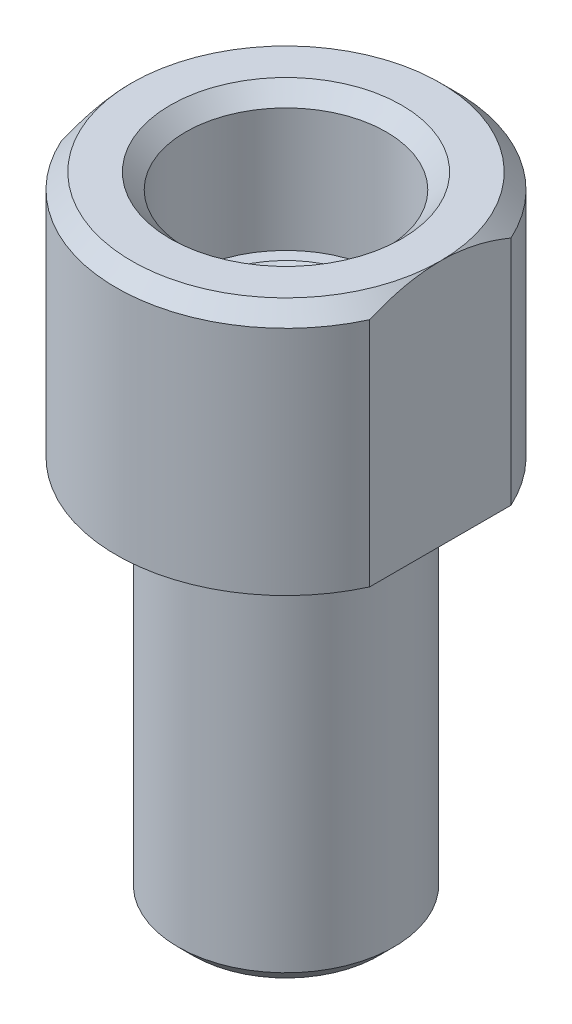
ISO-10303-21;
HEADER;
FILE_DESCRIPTION(('STEP AP214'),'2;1');
FILE_NAME('part.step','',(''),(''),'','','');
FILE_SCHEMA(('AUTOMOTIVE_DESIGN { 1 0 10303 214 1 1 1 1 }'));
ENDSEC;
DATA;
#1=APPLICATION_CONTEXT('core data for automotive mechanical design processes');
#2=APPLICATION_PROTOCOL_DEFINITION('international standard','automotive_design',2000,#1);
#3=PRODUCT_CONTEXT('',#1,'mechanical');
#4=PRODUCT('Part','Part','',(#3));
#5=PRODUCT_RELATED_PRODUCT_CATEGORY('part','',(#4));
#6=PRODUCT_DEFINITION_FORMATION('','',#4);
#7=PRODUCT_DEFINITION_CONTEXT('part definition',#1,'design');
#8=PRODUCT_DEFINITION('design','',#6,#7);
#9=PRODUCT_DEFINITION_SHAPE('','',#8);
#10=(LENGTH_UNIT() NAMED_UNIT(*) SI_UNIT(.MILLI.,.METRE.));
#11=(NAMED_UNIT(*) PLANE_ANGLE_UNIT() SI_UNIT($,.RADIAN.));
#12=(NAMED_UNIT(*) SI_UNIT($,.STERADIAN.) SOLID_ANGLE_UNIT());
#13=UNCERTAINTY_MEASURE_WITH_UNIT(LENGTH_MEASURE(1.E-05),#10,'distance_accuracy_value','');
#14=(GEOMETRIC_REPRESENTATION_CONTEXT(3) GLOBAL_UNCERTAINTY_ASSIGNED_CONTEXT((#13)) GLOBAL_UNIT_ASSIGNED_CONTEXT((#10,
#11,#12)) REPRESENTATION_CONTEXT('',''));
#15=CARTESIAN_POINT('',(0.,0.,0.));
#16=DIRECTION('',(0.,0.,1.));
#17=DIRECTION('',(1.,0.,0.));
#18=AXIS2_PLACEMENT_3D('',#15,#16,#17);
#19=CARTESIAN_POINT('',(0.,0.,0.));
#20=DIRECTION('',(0.,-1.,0.));
#21=DIRECTION('',(0.,0.,-1.));
#22=AXIS2_PLACEMENT_3D('',#19,#20,#21);
#23=CYLINDRICAL_SURFACE('',#22,11.);
#24=CARTESIAN_POINT('',(0.,40.,0.));
#25=DIRECTION('',(0.,-1.,0.));
#26=DIRECTION('',(0.,0.,-1.));
#27=AXIS2_PLACEMENT_3D('',#24,#25,#26);
#28=CIRCLE('',#27,11.);
#29=CARTESIAN_POINT('',(10.,40.,4.58257569495584));
#30=VERTEX_POINT('',#29);
#31=CARTESIAN_POINT('',(-10.,40.,4.58257569495584));
#32=VERTEX_POINT('',#31);
#33=EDGE_CURVE('E143',#30,#32,#28,.T.);
#34=ORIENTED_EDGE('',*,*,#33,.T.);
#35=DIRECTION('',(0.,1.,0.));
#36=VECTOR('',#35,1.);
#37=CARTESIAN_POINT('',(-10.,0.,4.58257569495584));
#38=LINE('',#37,#36);
#39=CARTESIAN_POINT('',(-10.,25.,4.58257569495584));
#40=VERTEX_POINT('',#39);
#41=EDGE_CURVE('E112',#40,#32,#38,.T.);
#42=ORIENTED_EDGE('',*,*,#41,.F.);
#43=CARTESIAN_POINT('',(0.,25.,0.));
#44=DIRECTION('',(0.,-1.,0.));
#45=DIRECTION('',(0.,0.,-1.));
#46=AXIS2_PLACEMENT_3D('',#43,#44,#45);
#47=CIRCLE('',#46,11.);
#48=CARTESIAN_POINT('',(10.,25.,4.58257569495584));
#49=VERTEX_POINT('',#48);
#50=EDGE_CURVE('E116',#49,#40,#47,.T.);
#51=ORIENTED_EDGE('',*,*,#50,.F.);
#52=DIRECTION('',(0.,1.,0.));
#53=VECTOR('',#52,1.);
#54=CARTESIAN_POINT('',(10.,0.,4.58257569495584));
#55=LINE('',#54,#53);
#56=EDGE_CURVE('E96',#49,#30,#55,.T.);
#57=ORIENTED_EDGE('',*,*,#56,.T.);
#58=EDGE_LOOP('',(#34,#42,#51,#57));
#59=FACE_BOUND('',#58,.T.);
#60=ADVANCED_FACE('F45',(#59),#23,.T.);
#61=CARTESIAN_POINT('',(0.,40.,0.));
#62=DIRECTION('',(0.,-1.,0.));
#63=DIRECTION('',(0.,0.,-1.));
#64=AXIS2_PLACEMENT_3D('',#61,#62,#63);
#65=CONICAL_SURFACE('',#64,11.,0.785398163397451);
#66=CARTESIAN_POINT('',(-10.,33.9558208884919,13.8023201522487));
#67=CARTESIAN_POINT('',(-10.,34.1778208154301,13.5281446995783));
#68=CARTESIAN_POINT('',(-10.,34.3984811201019,13.2528745160458));
#69=CARTESIAN_POINT('',(-10.,34.8366072236737,12.6997638065627));
#70=CARTESIAN_POINT('',(-10.,35.054072726021,12.4219230458548));
#71=CARTESIAN_POINT('',(-10.,35.4857774289004,11.8626611221523));
#72=CARTESIAN_POINT('',(-10.,35.7000074907922,11.5812328917973));
#73=CARTESIAN_POINT('',(-10.,36.123990173907,11.0150304484663));
#74=CARTESIAN_POINT('',(-10.,36.3337429187202,10.7302563281862));
#75=CARTESIAN_POINT('',(-10.,36.7537156666972,10.1488021450887));
#76=CARTESIAN_POINT('',(-10.,36.9637838378488,9.85201214723629));
#77=CARTESIAN_POINT('',(-10.,37.3770698019886,9.2537036827211));
#78=CARTESIAN_POINT('',(-10.,37.5802878629714,8.95218540171908));
#79=CARTESIAN_POINT('',(-10.,37.9781718508272,8.34391394804862));
#80=CARTESIAN_POINT('',(-10.,38.1728451057146,8.03716558710198));
#81=CARTESIAN_POINT('',(-10.,38.5518260926954,7.4173562765086));
#82=CARTESIAN_POINT('',(-10.,38.7361351800235,7.10429615950402));
#83=CARTESIAN_POINT('',(-10.,39.0950110581904,6.46528432181227));
#84=CARTESIAN_POINT('',(-10.,39.2693477409349,6.13920250644198));
#85=CARTESIAN_POINT('',(-10.,39.6012275669949,5.47846880101658));
#86=CARTESIAN_POINT('',(-10.,39.7587683337728,5.14381570645513));
#87=CARTESIAN_POINT('',(-10.,40.0518299330828,4.46709227974773));
#88=CARTESIAN_POINT('',(-10.,40.1874670596512,4.12507283831696));
#89=CARTESIAN_POINT('',(-10.,40.4325181179918,3.43171443598366));
#90=CARTESIAN_POINT('',(-10.,40.5419398586343,3.08037828500331));
#91=CARTESIAN_POINT('',(-10.,40.7109206763749,2.43760625834064));
#92=CARTESIAN_POINT('',(-10.,40.7760211522216,2.14763548785813));
#93=CARTESIAN_POINT('',(-10.,40.8826052141818,1.56335916692039));
#94=CARTESIAN_POINT('',(-10.,40.9240922338972,1.26905425307521));
#95=CARTESIAN_POINT('',(-10.,40.9813152468346,0.678418186148784));
#96=CARTESIAN_POINT('',(-10.,40.9970946764285,0.38209130217933));
#97=CARTESIAN_POINT('',(-10.,41.0021718011215,-0.21079788170568));
#98=CARTESIAN_POINT('',(-10.,40.9914691328545,-0.507360184795654));
#99=CARTESIAN_POINT('',(-10.,40.9442406460569,-1.09755181234182));
#100=CARTESIAN_POINT('',(-10.,40.907787239327,-1.39118702522351));
#101=CARTESIAN_POINT('',(-10.,40.8109999475183,-1.97446197359062));
#102=CARTESIAN_POINT('',(-10.,40.7506641022424,-2.26410137909262));
#103=CARTESIAN_POINT('',(-10.,40.608575095825,-2.83893767081939));
#104=CARTESIAN_POINT('',(-10.,40.5267581592289,-3.12411860320021));
#105=CARTESIAN_POINT('',(-10.,40.344788710314,-3.68848234703524));
#106=CARTESIAN_POINT('',(-10.,40.2446371250647,-3.96766546096479));
#107=CARTESIAN_POINT('',(-10.,39.9890298248807,-4.62198737010219));
#108=CARTESIAN_POINT('',(-10.,39.8268113199149,-4.99447449719005));
#109=CARTESIAN_POINT('',(-10.,39.4797959373315,-5.72886799789962));
#110=CARTESIAN_POINT('',(-10.,39.2949863331944,-6.09076826391463));
#111=CARTESIAN_POINT('',(-10.,38.9075122469249,-6.8057845361489));
#112=CARTESIAN_POINT('',(-10.,38.7048113154796,-7.15888063867933));
#113=CARTESIAN_POINT('',(-10.,38.2858022838572,-7.85675814765458));
#114=CARTESIAN_POINT('',(-10.,38.0694967179505,-8.20154108621875));
#115=CARTESIAN_POINT('',(-10.,37.6251503878258,-8.88563515770525));
#116=CARTESIAN_POINT('',(-10.,37.3970611939933,-9.22491468441265));
#117=CARTESIAN_POINT('',(-10.,36.9322512758756,-9.89750536092675));
#118=CARTESIAN_POINT('',(-10.,36.6955302211982,-10.2308162815501));
#119=CARTESIAN_POINT('',(-10.,36.2153885103424,-10.892030337779));
#120=CARTESIAN_POINT('',(-10.,35.9719751127363,-11.2199387598704));
#121=CARTESIAN_POINT('',(-10.,35.4794950720385,-11.8714595060013));
#122=CARTESIAN_POINT('',(-10.,35.2304286040159,-12.1950719625913));
#123=CARTESIAN_POINT('',(-10.,34.894569723632,-12.6249521717297));
#124=CARTESIAN_POINT('',(-10.,34.8098491326932,-12.7328455384171));
#125=CARTESIAN_POINT('',(-10.,34.6399056315398,-12.948246044883));
#126=CARTESIAN_POINT('',(-10.,34.5546826932787,-13.0557531625473));
#127=CARTESIAN_POINT('',(-10.,34.2989831112781,-13.3768704371523));
#128=CARTESIAN_POINT('',(-10.,34.1278104958349,-13.5899270144305));
#129=CARTESIAN_POINT('',(-10.,33.9558208884919,-13.8023201522487));
#130=B_SPLINE_CURVE_WITH_KNOTS('',3,(#66,#67,#68,#69,#70,#71,#72,#73,#74,#75,#76,#77,#78,#79,
#80,#81,#82,#83,#84,#85,#86,#87,#88,#89,#90,#91,#92,#93,#94,#95,#96,#97,#98,#99,#100,#101,#102,
#103,#104,#105,#106,#107,#108,#109,#110,#111,#112,#113,#114,#115,#116,#117,#118,#119,#120,#121,
#122,#123,#124,#125,#126,#127,#128,#129),.UNSPECIFIED.,.F.,.F.,(4,2,2,2,2,2,2,2,2,2,2,2,2,2,2,2,
2,2,2,2,2,2,2,2,2,2,2,2,2,2,2,4),(0.,1.05835764237732,2.11681291228604,3.17784383947429,
4.23884544038392,5.32959917955135,6.42031019588738,7.51006677541922,8.59968052372284,
9.70857556221561,10.8176272961115,11.9205819784915,13.0232077102154,13.9139192586189,
14.8045012567045,15.6935769322822,16.5826648071097,17.4692624433897,18.3559328639627,
19.245266097483,20.1345543753512,21.3523569110053,22.570848675495,23.7918827998985,
25.012690139975,26.2389912889146,27.4653394249967,28.6904062005689,29.915435088883,
30.326976565307,30.7385412401215,31.5584314749219),.UNSPECIFIED.);
#131=CARTESIAN_POINT('',(-10.,41.,0.));
#132=VERTEX_POINT('',#131);
#133=EDGE_CURVE('E69',#32,#132,#130,.T.);
#134=ORIENTED_EDGE('',*,*,#133,.F.);
#135=ORIENTED_EDGE('',*,*,#33,.F.);
#136=CARTESIAN_POINT('',(10.,33.9558208884919,-13.8023201522487));
#137=CARTESIAN_POINT('',(10.,34.1778208154301,-13.5281446995783));
#138=CARTESIAN_POINT('',(10.,34.3984811201019,-13.2528745160458));
#139=CARTESIAN_POINT('',(10.,34.8366072236737,-12.6997638065627));
#140=CARTESIAN_POINT('',(10.,35.054072726021,-12.4219230458548));
#141=CARTESIAN_POINT('',(10.,35.4857774289004,-11.8626611221523));
#142=CARTESIAN_POINT('',(10.,35.7000074907922,-11.5812328917973));
#143=CARTESIAN_POINT('',(10.,36.123990173907,-11.0150304484663));
#144=CARTESIAN_POINT('',(10.,36.3337429187202,-10.7302563281862));
#145=CARTESIAN_POINT('',(10.,36.7537156666972,-10.1488021450887));
#146=CARTESIAN_POINT('',(10.,36.9637838378488,-9.85201214723629));
#147=CARTESIAN_POINT('',(10.,37.3770698019886,-9.2537036827211));
#148=CARTESIAN_POINT('',(10.,37.5802878629714,-8.95218540171908));
#149=CARTESIAN_POINT('',(10.,37.9781718508272,-8.34391394804862));
#150=CARTESIAN_POINT('',(10.,38.1728451057146,-8.03716558710198));
#151=CARTESIAN_POINT('',(10.,38.5518260926954,-7.4173562765086));
#152=CARTESIAN_POINT('',(10.,38.7361351800235,-7.10429615950402));
#153=CARTESIAN_POINT('',(10.,39.0950110581904,-6.46528432181227));
#154=CARTESIAN_POINT('',(10.,39.2693477409349,-6.13920250644198));
#155=CARTESIAN_POINT('',(10.,39.6012275669949,-5.47846880101658));
#156=CARTESIAN_POINT('',(10.,39.7587683337728,-5.14381570645513));
#157=CARTESIAN_POINT('',(10.,40.0518299330828,-4.46709227974773));
#158=CARTESIAN_POINT('',(10.,40.1874670596512,-4.12507283831696));
#159=CARTESIAN_POINT('',(10.,40.4325181179918,-3.43171443598366));
#160=CARTESIAN_POINT('',(10.,40.5419398586343,-3.08037828500331));
#161=CARTESIAN_POINT('',(10.,40.7109206763749,-2.43760625834064));
#162=CARTESIAN_POINT('',(10.,40.7760211522216,-2.14763548785813));
#163=CARTESIAN_POINT('',(10.,40.8826052141818,-1.56335916692039));
#164=CARTESIAN_POINT('',(10.,40.9240922338972,-1.26905425307521));
#165=CARTESIAN_POINT('',(10.,40.9813152468346,-0.678418186148784));
#166=CARTESIAN_POINT('',(10.,40.9970946764285,-0.38209130217933));
#167=CARTESIAN_POINT('',(10.,41.0021718011215,0.21079788170568));
#168=CARTESIAN_POINT('',(10.,40.9914691328545,0.507360184795654));
#169=CARTESIAN_POINT('',(10.,40.9442406460569,1.09755181234182));
#170=CARTESIAN_POINT('',(10.,40.907787239327,1.39118702522351));
#171=CARTESIAN_POINT('',(10.,40.8109999475183,1.97446197359062));
#172=CARTESIAN_POINT('',(10.,40.7506641022424,2.26410137909262));
#173=CARTESIAN_POINT('',(10.,40.608575095825,2.83893767081939));
#174=CARTESIAN_POINT('',(10.,40.5267581592289,3.12411860320021));
#175=CARTESIAN_POINT('',(10.,40.344788710314,3.68848234703524));
#176=CARTESIAN_POINT('',(10.,40.2446371250647,3.96766546096479));
#177=CARTESIAN_POINT('',(10.,39.9890298248807,4.62198737010219));
#178=CARTESIAN_POINT('',(10.,39.8268113199149,4.99447449719005));
#179=CARTESIAN_POINT('',(10.,39.4797959373315,5.72886799789962));
#180=CARTESIAN_POINT('',(10.,39.2949863331944,6.09076826391463));
#181=CARTESIAN_POINT('',(10.,38.9075122469249,6.8057845361489));
#182=CARTESIAN_POINT('',(10.,38.7048113154796,7.15888063867933));
#183=CARTESIAN_POINT('',(10.,38.2858022838572,7.85675814765458));
#184=CARTESIAN_POINT('',(10.,38.0694967179505,8.20154108621875));
#185=CARTESIAN_POINT('',(10.,37.6251503878258,8.88563515770525));
#186=CARTESIAN_POINT('',(10.,37.3970611939933,9.22491468441265));
#187=CARTESIAN_POINT('',(10.,36.9322512758756,9.89750536092675));
#188=CARTESIAN_POINT('',(10.,36.6955302211982,10.2308162815501));
#189=CARTESIAN_POINT('',(10.,36.2153885103424,10.892030337779));
#190=CARTESIAN_POINT('',(10.,35.9719751127363,11.2199387598704));
#191=CARTESIAN_POINT('',(10.,35.4794950720385,11.8714595060013));
#192=CARTESIAN_POINT('',(10.,35.2304286040159,12.1950719625913));
#193=CARTESIAN_POINT('',(10.,34.894569723632,12.6249521717297));
#194=CARTESIAN_POINT('',(10.,34.8098491326932,12.7328455384171));
#195=CARTESIAN_POINT('',(10.,34.6399056315398,12.948246044883));
#196=CARTESIAN_POINT('',(10.,34.5546826932787,13.0557531625473));
#197=CARTESIAN_POINT('',(10.,34.2989831112781,13.3768704371523));
#198=CARTESIAN_POINT('',(10.,34.1278104958349,13.5899270144305));
#199=CARTESIAN_POINT('',(10.,33.9558208884919,13.8023201522487));
#200=B_SPLINE_CURVE_WITH_KNOTS('',3,(#136,#137,#138,#139,#140,#141,#142,#143,#144,#145,#146,
#147,#148,#149,#150,#151,#152,#153,#154,#155,#156,#157,#158,#159,#160,#161,#162,#163,#164,#165,
#166,#167,#168,#169,#170,#171,#172,#173,#174,#175,#176,#177,#178,#179,#180,#181,#182,#183,#184,
#185,#186,#187,#188,#189,#190,#191,#192,#193,#194,#195,#196,#197,#198,#199),.UNSPECIFIED.,.F.,
.F.,(4,2,2,2,2,2,2,2,2,2,2,2,2,2,2,2,2,2,2,2,2,2,2,2,2,2,2,2,2,2,2,4),(0.,1.05835764237732,
2.11681291228604,3.17784383947429,4.23884544038392,5.32959917955135,6.42031019588738,
7.51006677541922,8.59968052372284,9.70857556221561,10.8176272961115,11.9205819784915,
13.0232077102154,13.9139192586189,14.8045012567045,15.6935769322822,16.5826648071097,
17.4692624433897,18.3559328639627,19.245266097483,20.1345543753512,21.3523569110053,
22.570848675495,23.7918827998985,25.012690139975,26.2389912889146,27.4653394249967,
28.6904062005689,29.915435088883,30.326976565307,30.7385412401215,31.5584314749219),.UNSPECIFIED.);
#201=CARTESIAN_POINT('',(10.,41.,0.));
#202=VERTEX_POINT('',#201);
#203=EDGE_CURVE('E147',#202,#30,#200,.T.);
#204=ORIENTED_EDGE('',*,*,#203,.F.);
#205=CARTESIAN_POINT('',(0.,41.,0.));
#206=DIRECTION('',(0.,-1.,0.));
#207=DIRECTION('',(0.,0.,-1.));
#208=AXIS2_PLACEMENT_3D('',#205,#206,#207);
#209=CIRCLE('',#208,10.);
#210=EDGE_CURVE('E144',#132,#202,#209,.F.);
#211=ORIENTED_EDGE('',*,*,#210,.F.);
#212=EDGE_LOOP('',(#134,#135,#204,#211));
#213=FACE_BOUND('',#212,.T.);
#214=ADVANCED_FACE('F231',(#213),#65,.T.);
#215=CARTESIAN_POINT('',(0.,10.,0.));
#216=DIRECTION('',(0.,1.,0.));
#217=DIRECTION('',(0.,0.,1.));
#218=AXIS2_PLACEMENT_3D('',#215,#216,#217);
#219=PLANE('',#218);
#220=CARTESIAN_POINT('',(0.,10.,0.));
#221=DIRECTION('',(0.,1.,0.));
#222=DIRECTION('',(0.,0.,1.));
#223=AXIS2_PLACEMENT_3D('',#220,#221,#222);
#224=CIRCLE('',#223,4.5);
#225=CARTESIAN_POINT('',(0.,10.,4.5));
#226=VERTEX_POINT('',#225);
#227=EDGE_CURVE('E498',#226,#226,#224,.T.);
#228=ORIENTED_EDGE('',*,*,#227,.T.);
#229=EDGE_LOOP('',(#228));
#230=FACE_BOUND('',#229,.T.);
#231=CARTESIAN_POINT('',(0.,10.,0.));
#232=DIRECTION('',(0.,-1.,0.));
#233=DIRECTION('',(0.,0.,-1.));
#234=AXIS2_PLACEMENT_3D('',#231,#232,#233);
#235=CIRCLE('',#234,4.8);
#236=CARTESIAN_POINT('',(0.,10.,-4.8));
#237=VERTEX_POINT('',#236);
#238=EDGE_CURVE('E139',#237,#237,#235,.T.);
#239=ORIENTED_EDGE('',*,*,#238,.T.);
#240=EDGE_LOOP('',(#239));
#241=FACE_BOUND('',#240,.T.);
#242=ADVANCED_FACE('F228',(#230,#241),#219,.F.);
#243=CARTESIAN_POINT('',(0.,0.,0.));
#244=DIRECTION('',(0.,-1.,0.));
#245=DIRECTION('',(0.,0.,-1.));
#246=AXIS2_PLACEMENT_3D('',#243,#244,#245);
#247=CYLINDRICAL_SURFACE('',#246,4.8);
#248=CARTESIAN_POINT('',(0.,0.500000000000002,0.));
#249=DIRECTION('',(0.,1.,0.));
#250=DIRECTION('',(0.,0.,1.));
#251=AXIS2_PLACEMENT_3D('',#248,#249,#250);
#252=CIRCLE('',#251,4.8);
#253=CARTESIAN_POINT('',(0.,0.500000000000002,4.8));
#254=VERTEX_POINT('',#253);
#255=EDGE_CURVE('E511',#254,#254,#252,.F.);
#256=ORIENTED_EDGE('',*,*,#255,.T.);
#257=EDGE_LOOP('',(#256));
#258=FACE_BOUND('',#257,.T.);
#259=ORIENTED_EDGE('',*,*,#238,.F.);
#260=EDGE_LOOP('',(#259));
#261=FACE_BOUND('',#260,.T.);
#262=ADVANCED_FACE('F225',(#258,#261),#247,.F.);
#263=CARTESIAN_POINT('',(0.,0.,0.));
#264=DIRECTION('',(0.,1.,0.));
#265=DIRECTION('',(0.,0.,1.));
#266=AXIS2_PLACEMENT_3D('',#263,#264,#265);
#267=PLANE('',#266);
#268=CARTESIAN_POINT('',(0.,0.,0.));
#269=DIRECTION('',(0.,1.,0.));
#270=DIRECTION('',(0.,0.,1.));
#271=AXIS2_PLACEMENT_3D('',#268,#269,#270);
#272=CIRCLE('',#271,5.3);
#273=CARTESIAN_POINT('',(0.,0.,5.3));
#274=VERTEX_POINT('',#273);
#275=EDGE_CURVE('E508',#274,#274,#272,.T.);
#276=ORIENTED_EDGE('',*,*,#275,.T.);
#277=EDGE_LOOP('',(#276));
#278=FACE_BOUND('',#277,.T.);
#279=CARTESIAN_POINT('',(0.,0.,0.));
#280=DIRECTION('',(0.,1.,0.));
#281=DIRECTION('',(0.,0.,1.));
#282=AXIS2_PLACEMENT_3D('',#279,#280,#281);
#283=CIRCLE('',#282,6.);
#284=CARTESIAN_POINT('',(0.,0.,6.));
#285=VERTEX_POINT('',#284);
#286=EDGE_CURVE('E251',#285,#285,#283,.F.);
#287=ORIENTED_EDGE('',*,*,#286,.T.);
#288=EDGE_LOOP('',(#287));
#289=FACE_BOUND('',#288,.T.);
#290=ADVANCED_FACE('F221',(#278,#289),#267,.F.);
#291=CARTESIAN_POINT('',(0.,0.,0.));
#292=DIRECTION('',(0.,-1.,0.));
#293=DIRECTION('',(0.,0.,-1.));
#294=AXIS2_PLACEMENT_3D('',#291,#292,#293);
#295=CYLINDRICAL_SURFACE('',#294,7.);
#296=CARTESIAN_POINT('',(0.,1.,0.));
#297=DIRECTION('',(0.,1.,0.));
#298=DIRECTION('',(0.,0.,1.));
#299=AXIS2_PLACEMENT_3D('',#296,#297,#298);
#300=CIRCLE('',#299,7.);
#301=CARTESIAN_POINT('',(0.,1.,7.));
#302=VERTEX_POINT('',#301);
#303=EDGE_CURVE('E253',#302,#302,#300,.T.);
#304=ORIENTED_EDGE('',*,*,#303,.T.);
#305=EDGE_LOOP('',(#304));
#306=FACE_BOUND('',#305,.T.);
#307=CARTESIAN_POINT('',(0.,25.,0.));
#308=DIRECTION('',(0.,-1.,0.));
#309=DIRECTION('',(0.,0.,-1.));
#310=AXIS2_PLACEMENT_3D('',#307,#308,#309);
#311=CIRCLE('',#310,7.);
#312=CARTESIAN_POINT('',(0.,25.,-7.));
#313=VERTEX_POINT('',#312);
#314=EDGE_CURVE('E136',#313,#313,#311,.T.);
#315=ORIENTED_EDGE('',*,*,#314,.T.);
#316=EDGE_LOOP('',(#315));
#317=FACE_BOUND('',#316,.T.);
#318=ADVANCED_FACE('F217',(#306,#317),#295,.T.);
#319=CARTESIAN_POINT('',(0.,25.,0.));
#320=DIRECTION('',(0.,1.,0.));
#321=DIRECTION('',(0.,0.,1.));
#322=AXIS2_PLACEMENT_3D('',#319,#320,#321);
#323=PLANE('',#322);
#324=ORIENTED_EDGE('',*,*,#314,.F.);
#325=EDGE_LOOP('',(#324));
#326=FACE_BOUND('',#325,.T.);
#327=CARTESIAN_POINT('',(0.,25.,0.));
#328=DIRECTION('',(0.,-1.,0.));
#329=DIRECTION('',(0.,0.,-1.));
#330=AXIS2_PLACEMENT_3D('',#327,#328,#329);
#331=CIRCLE('',#330,7.55);
#332=CARTESIAN_POINT('',(0.,25.,-7.55));
#333=VERTEX_POINT('',#332);
#334=EDGE_CURVE('E133',#333,#333,#331,.T.);
#335=ORIENTED_EDGE('',*,*,#334,.T.);
#336=EDGE_LOOP('',(#335));
#337=FACE_BOUND('',#336,.T.);
#338=ADVANCED_FACE('F213',(#326,#337),#323,.F.);
#339=CARTESIAN_POINT('',(0.,0.,0.));
#340=DIRECTION('',(0.,-1.,0.));
#341=DIRECTION('',(0.,0.,-1.));
#342=AXIS2_PLACEMENT_3D('',#339,#340,#341);
#343=CYLINDRICAL_SURFACE('',#342,7.55);
#344=ORIENTED_EDGE('',*,*,#334,.F.);
#345=EDGE_LOOP('',(#344));
#346=FACE_BOUND('',#345,.T.);
#347=CARTESIAN_POINT('',(0.,26.13,0.));
#348=DIRECTION('',(0.,-1.,0.));
#349=DIRECTION('',(0.,0.,-1.));
#350=AXIS2_PLACEMENT_3D('',#347,#348,#349);
#351=CIRCLE('',#350,7.55);
#352=CARTESIAN_POINT('',(0.,26.13,-7.55));
#353=VERTEX_POINT('',#352);
#354=EDGE_CURVE('E130',#353,#353,#351,.T.);
#355=ORIENTED_EDGE('',*,*,#354,.T.);
#356=EDGE_LOOP('',(#355));
#357=FACE_BOUND('',#356,.T.);
#358=ADVANCED_FACE('F209',(#346,#357),#343,.T.);
#359=CARTESIAN_POINT('',(0.,26.13,0.));
#360=DIRECTION('',(0.,1.,0.));
#361=DIRECTION('',(0.,0.,1.));
#362=AXIS2_PLACEMENT_3D('',#359,#360,#361);
#363=PLANE('',#362);
#364=ORIENTED_EDGE('',*,*,#354,.F.);
#365=EDGE_LOOP('',(#364));
#366=FACE_BOUND('',#365,.T.);
#367=CARTESIAN_POINT('',(0.,26.13,0.));
#368=DIRECTION('',(0.,-1.,0.));
#369=DIRECTION('',(0.,0.,-1.));
#370=AXIS2_PLACEMENT_3D('',#367,#368,#369);
#371=CIRCLE('',#370,9.55);
#372=CARTESIAN_POINT('',(0.,26.13,-9.55));
#373=VERTEX_POINT('',#372);
#374=EDGE_CURVE('E127',#373,#373,#371,.T.);
#375=ORIENTED_EDGE('',*,*,#374,.T.);
#376=EDGE_LOOP('',(#375));
#377=FACE_BOUND('',#376,.T.);
#378=ADVANCED_FACE('F205',(#366,#377),#363,.F.);
#379=CARTESIAN_POINT('',(0.,0.,0.));
#380=DIRECTION('',(0.,-1.,0.));
#381=DIRECTION('',(0.,0.,-1.));
#382=AXIS2_PLACEMENT_3D('',#379,#380,#381);
#383=CYLINDRICAL_SURFACE('',#382,9.55);
#384=ORIENTED_EDGE('',*,*,#374,.F.);
#385=EDGE_LOOP('',(#384));
#386=FACE_BOUND('',#385,.T.);
#387=CARTESIAN_POINT('',(0.,25.,0.));
#388=DIRECTION('',(0.,-1.,0.));
#389=DIRECTION('',(0.,0.,-1.));
#390=AXIS2_PLACEMENT_3D('',#387,#388,#389);
#391=CIRCLE('',#390,9.55);
#392=CARTESIAN_POINT('',(0.,25.,-9.55));
#393=VERTEX_POINT('',#392);
#394=EDGE_CURVE('E119',#393,#393,#391,.T.);
#395=ORIENTED_EDGE('',*,*,#394,.T.);
#396=EDGE_LOOP('',(#395));
#397=FACE_BOUND('',#396,.T.);
#398=ADVANCED_FACE('F201',(#386,#397),#383,.F.);
#399=CARTESIAN_POINT('',(0.,25.,0.));
#400=DIRECTION('',(0.,1.,0.));
#401=DIRECTION('',(0.,0.,1.));
#402=AXIS2_PLACEMENT_3D('',#399,#400,#401);
#403=PLANE('',#402);
#404=ORIENTED_EDGE('',*,*,#394,.F.);
#405=EDGE_LOOP('',(#404));
#406=FACE_BOUND('',#405,.T.);
#407=ORIENTED_EDGE('',*,*,#50,.T.);
#408=DIRECTION('',(0.,0.,-1.));
#409=VECTOR('',#408,1.);
#410=CARTESIAN_POINT('',(-10.,25.,0.));
#411=LINE('',#410,#409);
#412=CARTESIAN_POINT('',(-10.,25.,-4.58257569495584));
#413=VERTEX_POINT('',#412);
#414=EDGE_CURVE('E101',#40,#413,#411,.T.);
#415=ORIENTED_EDGE('',*,*,#414,.T.);
#416=CARTESIAN_POINT('',(10.,25.,-4.58257569495584));
#417=VERTEX_POINT('',#416);
#418=EDGE_CURVE('E109',#413,#417,#47,.T.);
#419=ORIENTED_EDGE('',*,*,#418,.T.);
#420=DIRECTION('',(0.,0.,1.));
#421=VECTOR('',#420,1.);
#422=CARTESIAN_POINT('',(10.,25.,0.));
#423=LINE('',#422,#421);
#424=EDGE_CURVE('E91',#417,#49,#423,.T.);
#425=ORIENTED_EDGE('',*,*,#424,.T.);
#426=EDGE_LOOP('',(#407,#415,#419,#425));
#427=FACE_BOUND('',#426,.T.);
#428=ADVANCED_FACE('F115',(#406,#427),#403,.F.);
#429=ORIENTED_EDGE('',*,*,#418,.F.);
#430=DIRECTION('',(0.,1.,0.));
#431=VECTOR('',#430,1.);
#432=CARTESIAN_POINT('',(-10.,0.,-4.58257569495584));
#433=LINE('',#432,#431);
#434=CARTESIAN_POINT('',(-10.,40.,-4.58257569495584));
#435=VERTEX_POINT('',#434);
#436=EDGE_CURVE('E102',#413,#435,#433,.T.);
#437=ORIENTED_EDGE('',*,*,#436,.T.);
#438=CARTESIAN_POINT('',(10.,40.,-4.58257569495584));
#439=VERTEX_POINT('',#438);
#440=EDGE_CURVE('E111',#435,#439,#28,.T.);
#441=ORIENTED_EDGE('',*,*,#440,.T.);
#442=DIRECTION('',(0.,1.,0.));
#443=VECTOR('',#442,1.);
#444=CARTESIAN_POINT('',(10.,0.,-4.58257569495584));
#445=LINE('',#444,#443);
#446=EDGE_CURVE('E94',#417,#439,#445,.T.);
#447=ORIENTED_EDGE('',*,*,#446,.F.);
#448=EDGE_LOOP('',(#429,#437,#441,#447));
#449=FACE_BOUND('',#448,.T.);
#450=ADVANCED_FACE('F107',(#449),#23,.T.);
#451=CARTESIAN_POINT('',(0.,41.,0.));
#452=DIRECTION('',(0.,-1.,0.));
#453=DIRECTION('',(0.,0.,-1.));
#454=AXIS2_PLACEMENT_3D('',#451,#452,#453);
#455=PLANE('',#454);
#456=CARTESIAN_POINT('',(0.,41.,0.));
#457=DIRECTION('',(0.,-1.,0.));
#458=DIRECTION('',(0.,0.,-1.));
#459=AXIS2_PLACEMENT_3D('',#456,#457,#458);
#460=CIRCLE('',#459,7.5);
#461=CARTESIAN_POINT('',(0.,41.,-7.5));
#462=VERTEX_POINT('',#461);
#463=EDGE_CURVE('E517',#462,#462,#460,.T.);
#464=ORIENTED_EDGE('',*,*,#463,.T.);
#465=EDGE_LOOP('',(#464));
#466=FACE_BOUND('',#465,.T.);
#467=ORIENTED_EDGE('',*,*,#210,.T.);
#468=EDGE_CURVE('E148',#202,#132,#209,.F.);
#469=ORIENTED_EDGE('',*,*,#468,.T.);
#470=EDGE_LOOP('',(#467,#469));
#471=FACE_BOUND('',#470,.T.);
#472=ADVANCED_FACE('F192',(#466,#471),#455,.F.);
#473=CARTESIAN_POINT('',(0.,0.,0.));
#474=DIRECTION('',(0.,-1.,0.));
#475=DIRECTION('',(0.,0.,-1.));
#476=AXIS2_PLACEMENT_3D('',#473,#474,#475);
#477=CYLINDRICAL_SURFACE('',#476,6.5);
#478=CARTESIAN_POINT('',(0.,40.,0.));
#479=DIRECTION('',(0.,-1.,0.));
#480=DIRECTION('',(0.,0.,-1.));
#481=AXIS2_PLACEMENT_3D('',#478,#479,#480);
#482=CIRCLE('',#481,6.5);
#483=CARTESIAN_POINT('',(0.,40.,-6.5));
#484=VERTEX_POINT('',#483);
#485=EDGE_CURVE('E514',#484,#484,#482,.F.);
#486=ORIENTED_EDGE('',*,*,#485,.T.);
#487=EDGE_LOOP('',(#486));
#488=FACE_BOUND('',#487,.T.);
#489=CARTESIAN_POINT('',(0.,32.,0.));
#490=DIRECTION('',(0.,-1.,0.));
#491=DIRECTION('',(0.,0.,-1.));
#492=AXIS2_PLACEMENT_3D('',#489,#490,#491);
#493=CIRCLE('',#492,6.5);
#494=CARTESIAN_POINT('',(0.,32.,-6.5));
#495=VERTEX_POINT('',#494);
#496=EDGE_CURVE('E117',#495,#495,#493,.T.);
#497=ORIENTED_EDGE('',*,*,#496,.T.);
#498=EDGE_LOOP('',(#497));
#499=FACE_BOUND('',#498,.T.);
#500=ADVANCED_FACE('F188',(#488,#499),#477,.F.);
#501=CARTESIAN_POINT('',(0.,32.,0.));
#502=DIRECTION('',(0.,-1.,0.));
#503=DIRECTION('',(0.,0.,-1.));
#504=AXIS2_PLACEMENT_3D('',#501,#502,#503);
#505=PLANE('',#504);
#506=CARTESIAN_POINT('',(0.,32.,0.));
#507=DIRECTION('',(0.,-1.,0.));
#508=DIRECTION('',(0.,0.,-1.));
#509=AXIS2_PLACEMENT_3D('',#506,#507,#508);
#510=CIRCLE('',#509,5.7);
#511=CARTESIAN_POINT('',(0.,32.,-5.7));
#512=VERTEX_POINT('',#511);
#513=EDGE_CURVE('E54',#512,#512,#510,.T.);
#514=ORIENTED_EDGE('',*,*,#513,.T.);
#515=EDGE_LOOP('',(#514));
#516=FACE_BOUND('',#515,.T.);
#517=ORIENTED_EDGE('',*,*,#496,.F.);
#518=EDGE_LOOP('',(#517));
#519=FACE_BOUND('',#518,.T.);
#520=ADVANCED_FACE('F184',(#516,#519),#505,.F.);
#521=CARTESIAN_POINT('',(0.,0.,0.));
#522=DIRECTION('',(0.,-1.,0.));
#523=DIRECTION('',(0.,0.,-1.));
#524=AXIS2_PLACEMENT_3D('',#521,#522,#523);
#525=CYLINDRICAL_SURFACE('',#524,5.2);
#526=CARTESIAN_POINT('',(0.,31.5,0.));
#527=DIRECTION('',(0.,-1.,0.));
#528=DIRECTION('',(0.,0.,-1.));
#529=AXIS2_PLACEMENT_3D('',#526,#527,#528);
#530=CIRCLE('',#529,5.2);
#531=CARTESIAN_POINT('',(0.,31.5,-5.2));
#532=VERTEX_POINT('',#531);
#533=EDGE_CURVE('E12',#532,#532,#530,.F.);
#534=ORIENTED_EDGE('',*,*,#533,.T.);
#535=EDGE_LOOP('',(#534));
#536=FACE_BOUND('',#535,.T.);
#537=CARTESIAN_POINT('',(0.,26.,0.));
#538=DIRECTION('',(0.,-1.,0.));
#539=DIRECTION('',(0.,0.,-1.));
#540=AXIS2_PLACEMENT_3D('',#537,#538,#539);
#541=CIRCLE('',#540,5.2);
#542=CARTESIAN_POINT('',(0.,26.,-5.2));
#543=VERTEX_POINT('',#542);
#544=EDGE_CURVE('E121',#543,#543,#541,.T.);
#545=ORIENTED_EDGE('',*,*,#544,.T.);
#546=EDGE_LOOP('',(#545));
#547=FACE_BOUND('',#546,.T.);
#548=ADVANCED_FACE('F180',(#536,#547),#525,.F.);
#549=CARTESIAN_POINT('',(0.,26.,0.));
#550=DIRECTION('',(0.,-1.,0.));
#551=DIRECTION('',(0.,0.,-1.));
#552=AXIS2_PLACEMENT_3D('',#549,#550,#551);
#553=PLANE('',#552);
#554=CARTESIAN_POINT('',(0.,26.,0.));
#555=DIRECTION('',(0.,-1.,0.));
#556=DIRECTION('',(0.,0.,-1.));
#557=AXIS2_PLACEMENT_3D('',#554,#555,#556);
#558=CIRCLE('',#557,4.5);
#559=CARTESIAN_POINT('',(0.,26.,-4.5));
#560=VERTEX_POINT('',#559);
#561=EDGE_CURVE('E496',#560,#560,#558,.T.);
#562=ORIENTED_EDGE('',*,*,#561,.T.);
#563=EDGE_LOOP('',(#562));
#564=FACE_BOUND('',#563,.T.);
#565=ORIENTED_EDGE('',*,*,#544,.F.);
#566=EDGE_LOOP('',(#565));
#567=FACE_BOUND('',#566,.T.);
#568=ADVANCED_FACE('F176',(#564,#567),#553,.F.);
#569=CARTESIAN_POINT('',(0.,0.,0.));
#570=DIRECTION('',(0.,-1.,0.));
#571=DIRECTION('',(0.,0.,-1.));
#572=AXIS2_PLACEMENT_3D('',#569,#570,#571);
#573=CYLINDRICAL_SURFACE('',#572,4.);
#574=CARTESIAN_POINT('',(0.,10.5,0.));
#575=DIRECTION('',(0.,1.,0.));
#576=DIRECTION('',(0.,0.,1.));
#577=AXIS2_PLACEMENT_3D('',#574,#575,#576);
#578=CIRCLE('',#577,4.);
#579=CARTESIAN_POINT('',(0.,10.5,4.));
#580=VERTEX_POINT('',#579);
#581=EDGE_CURVE('E502',#580,#580,#578,.F.);
#582=ORIENTED_EDGE('',*,*,#581,.T.);
#583=EDGE_LOOP('',(#582));
#584=FACE_BOUND('',#583,.T.);
#585=CARTESIAN_POINT('',(0.,25.5,0.));
#586=DIRECTION('',(0.,-1.,0.));
#587=DIRECTION('',(0.,0.,-1.));
#588=AXIS2_PLACEMENT_3D('',#585,#586,#587);
#589=CIRCLE('',#588,4.);
#590=CARTESIAN_POINT('',(0.,25.5,-4.));
#591=VERTEX_POINT('',#590);
#592=EDGE_CURVE('E505',#591,#591,#589,.F.);
#593=ORIENTED_EDGE('',*,*,#592,.T.);
#594=EDGE_LOOP('',(#593));
#595=FACE_BOUND('',#594,.T.);
#596=ADVANCED_FACE('F173',(#584,#595),#573,.F.);
#597=EDGE_CURVE('E156',#132,#435,#130,.T.);
#598=ORIENTED_EDGE('',*,*,#597,.F.);
#599=ORIENTED_EDGE('',*,*,#468,.F.);
#600=EDGE_CURVE('E61',#439,#202,#200,.T.);
#601=ORIENTED_EDGE('',*,*,#600,.F.);
#602=ORIENTED_EDGE('',*,*,#440,.F.);
#603=EDGE_LOOP('',(#598,#599,#601,#602));
#604=FACE_BOUND('',#603,.T.);
#605=ADVANCED_FACE('F164',(#604),#65,.T.);
#606=CARTESIAN_POINT('',(10.,0.,-4.58257569495584));
#607=DIRECTION('',(-1.,0.,0.));
#608=DIRECTION('',(0.,0.,1.));
#609=AXIS2_PLACEMENT_3D('',#606,#607,#608);
#610=PLANE('',#609);
#611=ORIENTED_EDGE('',*,*,#446,.T.);
#612=ORIENTED_EDGE('',*,*,#600,.T.);
#613=ORIENTED_EDGE('',*,*,#203,.T.);
#614=ORIENTED_EDGE('',*,*,#56,.F.);
#615=ORIENTED_EDGE('',*,*,#424,.F.);
#616=EDGE_LOOP('',(#611,#612,#613,#614,#615));
#617=FACE_BOUND('',#616,.T.);
#618=ADVANCED_FACE('F93',(#617),#610,.F.);
#619=CARTESIAN_POINT('',(-10.,0.,-4.58257569495584));
#620=DIRECTION('',(1.,0.,0.));
#621=DIRECTION('',(0.,0.,-1.));
#622=AXIS2_PLACEMENT_3D('',#619,#620,#621);
#623=PLANE('',#622);
#624=ORIENTED_EDGE('',*,*,#41,.T.);
#625=ORIENTED_EDGE('',*,*,#133,.T.);
#626=ORIENTED_EDGE('',*,*,#597,.T.);
#627=ORIENTED_EDGE('',*,*,#436,.F.);
#628=ORIENTED_EDGE('',*,*,#414,.F.);
#629=EDGE_LOOP('',(#624,#625,#626,#627,#628));
#630=FACE_BOUND('',#629,.T.);
#631=ADVANCED_FACE('F171',(#630),#623,.F.);
#632=CARTESIAN_POINT('',(0.,0.,0.));
#633=DIRECTION('',(0.,1.,0.));
#634=DIRECTION('',(0.,0.,1.));
#635=AXIS2_PLACEMENT_3D('',#632,#633,#634);
#636=CONICAL_SURFACE('',#635,6.,0.785398163397447);
#637=ORIENTED_EDGE('',*,*,#303,.F.);
#638=EDGE_LOOP('',(#637));
#639=FACE_BOUND('',#638,.T.);
#640=ORIENTED_EDGE('',*,*,#286,.F.);
#641=EDGE_LOOP('',(#640));
#642=FACE_BOUND('',#641,.T.);
#643=ADVANCED_FACE('F271',(#639,#642),#636,.T.);
#644=CARTESIAN_POINT('',(0.,41.,0.));
#645=DIRECTION('',(0.,1.,0.));
#646=DIRECTION('',(0.,0.,1.));
#647=AXIS2_PLACEMENT_3D('',#644,#645,#646);
#648=CONICAL_SURFACE('',#647,7.5,0.785398163397443);
#649=ORIENTED_EDGE('',*,*,#485,.F.);
#650=EDGE_LOOP('',(#649));
#651=FACE_BOUND('',#650,.T.);
#652=ORIENTED_EDGE('',*,*,#463,.F.);
#653=EDGE_LOOP('',(#652));
#654=FACE_BOUND('',#653,.T.);
#655=ADVANCED_FACE('F278',(#651,#654),#648,.F.);
#656=CARTESIAN_POINT('',(0.,0.500000000000002,0.));
#657=DIRECTION('',(0.,-1.,0.));
#658=DIRECTION('',(0.,0.,-1.));
#659=AXIS2_PLACEMENT_3D('',#656,#657,#658);
#660=CONICAL_SURFACE('',#659,4.8,0.785398163397446);
#661=ORIENTED_EDGE('',*,*,#275,.F.);
#662=EDGE_LOOP('',(#661));
#663=FACE_BOUND('',#662,.T.);
#664=ORIENTED_EDGE('',*,*,#255,.F.);
#665=EDGE_LOOP('',(#664));
#666=FACE_BOUND('',#665,.T.);
#667=ADVANCED_FACE('F286',(#663,#666),#660,.F.);
#668=CARTESIAN_POINT('',(0.,10.5,0.));
#669=DIRECTION('',(0.,-1.,0.));
#670=DIRECTION('',(0.,0.,-1.));
#671=AXIS2_PLACEMENT_3D('',#668,#669,#670);
#672=CONICAL_SURFACE('',#671,4.,0.785398163397448);
#673=ORIENTED_EDGE('',*,*,#227,.F.);
#674=EDGE_LOOP('',(#673));
#675=FACE_BOUND('',#674,.T.);
#676=ORIENTED_EDGE('',*,*,#581,.F.);
#677=EDGE_LOOP('',(#676));
#678=FACE_BOUND('',#677,.T.);
#679=ADVANCED_FACE('F294',(#675,#678),#672,.F.);
#680=CARTESIAN_POINT('',(0.,26.,0.));
#681=DIRECTION('',(0.,1.,0.));
#682=DIRECTION('',(0.,0.,1.));
#683=AXIS2_PLACEMENT_3D('',#680,#681,#682);
#684=CONICAL_SURFACE('',#683,4.5,0.785398163397448);
#685=ORIENTED_EDGE('',*,*,#592,.F.);
#686=EDGE_LOOP('',(#685));
#687=FACE_BOUND('',#686,.T.);
#688=ORIENTED_EDGE('',*,*,#561,.F.);
#689=EDGE_LOOP('',(#688));
#690=FACE_BOUND('',#689,.T.);
#691=ADVANCED_FACE('F302',(#687,#690),#684,.F.);
#692=CARTESIAN_POINT('',(0.,32.,0.));
#693=DIRECTION('',(0.,1.,0.));
#694=DIRECTION('',(0.,0.,1.));
#695=AXIS2_PLACEMENT_3D('',#692,#693,#694);
#696=CONICAL_SURFACE('',#695,5.7,0.785398163397448);
#697=ORIENTED_EDGE('',*,*,#533,.F.);
#698=EDGE_LOOP('',(#697));
#699=FACE_BOUND('',#698,.T.);
#700=ORIENTED_EDGE('',*,*,#513,.F.);
#701=EDGE_LOOP('',(#700));
#702=FACE_BOUND('',#701,.T.);
#703=ADVANCED_FACE('F48',(#699,#702),#696,.F.);
#704=CLOSED_SHELL('',(#60,#214,#242,#262,#290,#318,#338,#358,#378,#398,#428,#450,#472,#500,#520,
#548,#568,#596,#605,#618,#631,#643,#655,#667,#679,#691,#703));
#705=MANIFOLD_SOLID_BREP('B2',#704);
#706=ADVANCED_BREP_SHAPE_REPRESENTATION('',(#18,#705),#14);
#707=SHAPE_DEFINITION_REPRESENTATION(#9,#706);
ENDSEC;
END-ISO-10303-21;
